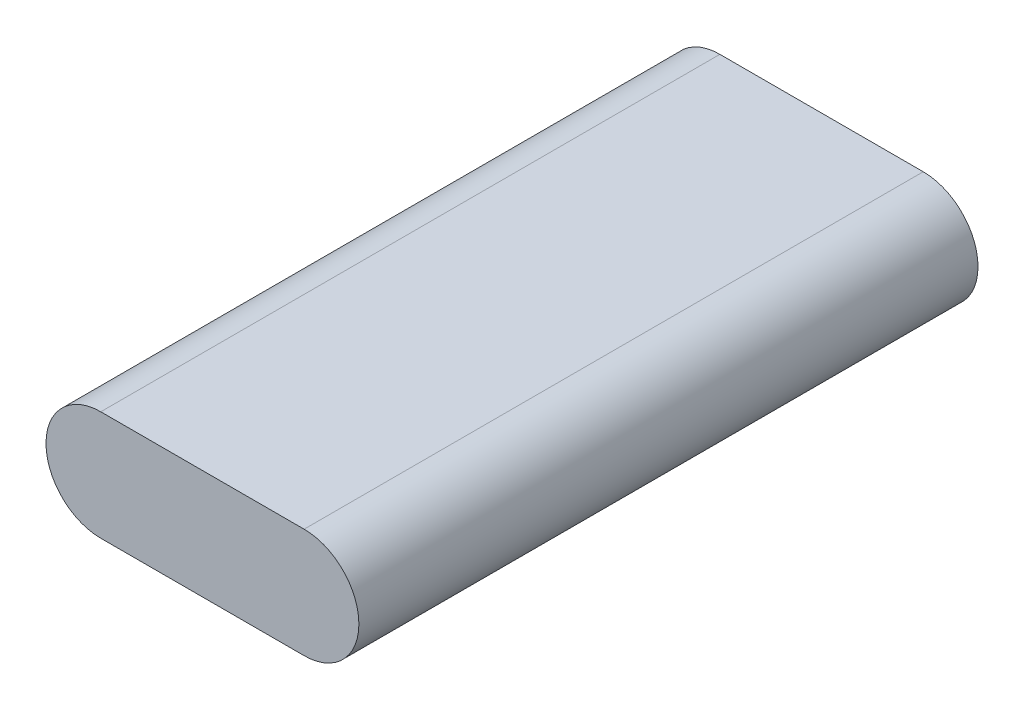
ISO-10303-21;
HEADER;
FILE_DESCRIPTION(('STEP AP214'),'2;1');
FILE_NAME('part.step','',(''),(''),'','','');
FILE_SCHEMA(('AUTOMOTIVE_DESIGN { 1 0 10303 214 1 1 1 1 }'));
ENDSEC;
DATA;
#1=APPLICATION_CONTEXT('core data for automotive mechanical design processes');
#2=APPLICATION_PROTOCOL_DEFINITION('international standard','automotive_design',2000,#1);
#3=PRODUCT_CONTEXT('',#1,'mechanical');
#4=PRODUCT('Part','Part','',(#3));
#5=PRODUCT_RELATED_PRODUCT_CATEGORY('part','',(#4));
#6=PRODUCT_DEFINITION_FORMATION('','',#4);
#7=PRODUCT_DEFINITION_CONTEXT('part definition',#1,'design');
#8=PRODUCT_DEFINITION('design','',#6,#7);
#9=PRODUCT_DEFINITION_SHAPE('','',#8);
#10=(LENGTH_UNIT() NAMED_UNIT(*) SI_UNIT(.MILLI.,.METRE.));
#11=(NAMED_UNIT(*) PLANE_ANGLE_UNIT() SI_UNIT($,.RADIAN.));
#12=(NAMED_UNIT(*) SI_UNIT($,.STERADIAN.) SOLID_ANGLE_UNIT());
#13=UNCERTAINTY_MEASURE_WITH_UNIT(LENGTH_MEASURE(1.E-05),#10,'distance_accuracy_value','');
#14=(GEOMETRIC_REPRESENTATION_CONTEXT(3) GLOBAL_UNCERTAINTY_ASSIGNED_CONTEXT((#13)) GLOBAL_UNIT_ASSIGNED_CONTEXT((#10,
#11,#12)) REPRESENTATION_CONTEXT('',''));
#15=CARTESIAN_POINT('',(0.,0.,0.));
#16=DIRECTION('',(0.,0.,1.));
#17=DIRECTION('',(1.,0.,0.));
#18=AXIS2_PLACEMENT_3D('',#15,#16,#17);
#19=CARTESIAN_POINT('',(0.,-10.0434533881483,130.));
#20=DIRECTION('',(0.,0.,-1.));
#21=DIRECTION('',(-1.,0.,0.));
#22=AXIS2_PLACEMENT_3D('',#19,#20,#21);
#23=CYLINDRICAL_SURFACE('',#22,11.5);
#24=CARTESIAN_POINT('',(0.,-10.0434533881483,0.));
#25=DIRECTION('',(0.,0.,1.));
#26=DIRECTION('',(1.,0.,0.));
#27=AXIS2_PLACEMENT_3D('',#24,#25,#26);
#28=CIRCLE('',#27,11.5);
#29=CARTESIAN_POINT('',(0.,1.45654661185173,0.));
#30=VERTEX_POINT('',#29);
#31=CARTESIAN_POINT('',(0.,-21.5434533881483,0.));
#32=VERTEX_POINT('',#31);
#33=EDGE_CURVE('E101',#30,#32,#28,.T.);
#34=ORIENTED_EDGE('',*,*,#33,.T.);
#35=DIRECTION('',(0.,0.,-1.));
#36=VECTOR('',#35,1.);
#37=CARTESIAN_POINT('',(0.,-21.5434533881483,130.));
#38=LINE('',#37,#36);
#39=CARTESIAN_POINT('',(0.,-21.5434533881483,130.));
#40=VERTEX_POINT('',#39);
#41=EDGE_CURVE('E11',#40,#32,#38,.T.);
#42=ORIENTED_EDGE('',*,*,#41,.F.);
#43=CARTESIAN_POINT('',(0.,-10.0434533881483,130.));
#44=DIRECTION('',(0.,0.,1.));
#45=DIRECTION('',(1.,0.,0.));
#46=AXIS2_PLACEMENT_3D('',#43,#44,#45);
#47=CIRCLE('',#46,11.5);
#48=CARTESIAN_POINT('',(0.,1.45654661185173,130.));
#49=VERTEX_POINT('',#48);
#50=EDGE_CURVE('E89',#49,#40,#47,.T.);
#51=ORIENTED_EDGE('',*,*,#50,.F.);
#52=DIRECTION('',(0.,0.,-1.));
#53=VECTOR('',#52,1.);
#54=CARTESIAN_POINT('',(0.,1.45654661185173,130.));
#55=LINE('',#54,#53);
#56=EDGE_CURVE('E97',#49,#30,#55,.T.);
#57=ORIENTED_EDGE('',*,*,#56,.T.);
#58=EDGE_LOOP('',(#34,#42,#51,#57));
#59=FACE_BOUND('',#58,.T.);
#60=ADVANCED_FACE('F38',(#59),#23,.T.);
#61=CARTESIAN_POINT('',(0.,-21.5434533881483,130.));
#62=DIRECTION('',(0.,1.,0.));
#63=DIRECTION('',(0.,0.,1.));
#64=AXIS2_PLACEMENT_3D('',#61,#62,#63);
#65=PLANE('',#64);
#66=DIRECTION('',(1.,0.,0.));
#67=VECTOR('',#66,1.);
#68=CARTESIAN_POINT('',(0.,-21.5434533881483,0.));
#69=LINE('',#68,#67);
#70=CARTESIAN_POINT('',(42.7,-21.5434533881483,0.));
#71=VERTEX_POINT('',#70);
#72=EDGE_CURVE('E93',#32,#71,#69,.T.);
#73=ORIENTED_EDGE('',*,*,#72,.T.);
#74=DIRECTION('',(0.,0.,-1.));
#75=VECTOR('',#74,1.);
#76=CARTESIAN_POINT('',(42.7,-21.5434533881483,130.));
#77=LINE('',#76,#75);
#78=CARTESIAN_POINT('',(42.7,-21.5434533881483,130.));
#79=VERTEX_POINT('',#78);
#80=EDGE_CURVE('E46',#79,#71,#77,.T.);
#81=ORIENTED_EDGE('',*,*,#80,.F.);
#82=DIRECTION('',(1.,0.,0.));
#83=VECTOR('',#82,1.);
#84=CARTESIAN_POINT('',(0.,-21.5434533881483,130.));
#85=LINE('',#84,#83);
#86=EDGE_CURVE('E84',#40,#79,#85,.T.);
#87=ORIENTED_EDGE('',*,*,#86,.F.);
#88=ORIENTED_EDGE('',*,*,#41,.T.);
#89=EDGE_LOOP('',(#73,#81,#87,#88));
#90=FACE_BOUND('',#89,.T.);
#91=ADVANCED_FACE('F92',(#90),#65,.F.);
#92=CARTESIAN_POINT('',(42.7,-10.0434533881483,130.));
#93=DIRECTION('',(0.,0.,-1.));
#94=DIRECTION('',(-1.,0.,0.));
#95=AXIS2_PLACEMENT_3D('',#92,#93,#94);
#96=CYLINDRICAL_SURFACE('',#95,11.5);
#97=CARTESIAN_POINT('',(42.7,-10.0434533881483,0.));
#98=DIRECTION('',(0.,0.,1.));
#99=DIRECTION('',(1.,0.,0.));
#100=AXIS2_PLACEMENT_3D('',#97,#98,#99);
#101=CIRCLE('',#100,11.5);
#102=CARTESIAN_POINT('',(42.7,1.45654661185173,0.));
#103=VERTEX_POINT('',#102);
#104=EDGE_CURVE('E71',#71,#103,#101,.T.);
#105=ORIENTED_EDGE('',*,*,#104,.T.);
#106=DIRECTION('',(0.,0.,-1.));
#107=VECTOR('',#106,1.);
#108=CARTESIAN_POINT('',(42.7,1.45654661185173,130.));
#109=LINE('',#108,#107);
#110=CARTESIAN_POINT('',(42.7,1.45654661185173,130.));
#111=VERTEX_POINT('',#110);
#112=EDGE_CURVE('E94',#111,#103,#109,.T.);
#113=ORIENTED_EDGE('',*,*,#112,.F.);
#114=CARTESIAN_POINT('',(42.7,-10.0434533881483,130.));
#115=DIRECTION('',(0.,0.,1.));
#116=DIRECTION('',(1.,0.,0.));
#117=AXIS2_PLACEMENT_3D('',#114,#115,#116);
#118=CIRCLE('',#117,11.5);
#119=EDGE_CURVE('E87',#79,#111,#118,.T.);
#120=ORIENTED_EDGE('',*,*,#119,.F.);
#121=ORIENTED_EDGE('',*,*,#80,.T.);
#122=EDGE_LOOP('',(#105,#113,#120,#121));
#123=FACE_BOUND('',#122,.T.);
#124=ADVANCED_FACE('F95',(#123),#96,.T.);
#125=CARTESIAN_POINT('',(0.,1.45654661185173,130.));
#126=DIRECTION('',(0.,-1.,0.));
#127=DIRECTION('',(0.,0.,-1.));
#128=AXIS2_PLACEMENT_3D('',#125,#126,#127);
#129=PLANE('',#128);
#130=DIRECTION('',(-1.,0.,0.));
#131=VECTOR('',#130,1.);
#132=CARTESIAN_POINT('',(0.,1.45654661185173,0.));
#133=LINE('',#132,#131);
#134=EDGE_CURVE('E77',#103,#30,#133,.T.);
#135=ORIENTED_EDGE('',*,*,#134,.T.);
#136=ORIENTED_EDGE('',*,*,#56,.F.);
#137=DIRECTION('',(-1.,0.,0.));
#138=VECTOR('',#137,1.);
#139=CARTESIAN_POINT('',(0.,1.45654661185173,130.));
#140=LINE('',#139,#138);
#141=EDGE_CURVE('E54',#111,#49,#140,.T.);
#142=ORIENTED_EDGE('',*,*,#141,.F.);
#143=ORIENTED_EDGE('',*,*,#112,.T.);
#144=EDGE_LOOP('',(#135,#136,#142,#143));
#145=FACE_BOUND('',#144,.T.);
#146=ADVANCED_FACE('F108',(#145),#129,.F.);
#147=CARTESIAN_POINT('',(0.,-10.0434533881483,130.));
#148=DIRECTION('',(0.,0.,1.));
#149=DIRECTION('',(1.,0.,0.));
#150=AXIS2_PLACEMENT_3D('',#147,#148,#149);
#151=PLANE('',#150);
#152=ORIENTED_EDGE('',*,*,#50,.T.);
#153=ORIENTED_EDGE('',*,*,#86,.T.);
#154=ORIENTED_EDGE('',*,*,#119,.T.);
#155=ORIENTED_EDGE('',*,*,#141,.T.);
#156=EDGE_LOOP('',(#152,#153,#154,#155));
#157=FACE_BOUND('',#156,.T.);
#158=ADVANCED_FACE('F85',(#157),#151,.T.);
#159=CARTESIAN_POINT('',(0.,-10.0434533881483,0.));
#160=DIRECTION('',(0.,0.,1.));
#161=DIRECTION('',(1.,0.,0.));
#162=AXIS2_PLACEMENT_3D('',#159,#160,#161);
#163=PLANE('',#162);
#164=ORIENTED_EDGE('',*,*,#33,.F.);
#165=ORIENTED_EDGE('',*,*,#134,.F.);
#166=ORIENTED_EDGE('',*,*,#104,.F.);
#167=ORIENTED_EDGE('',*,*,#72,.F.);
#168=EDGE_LOOP('',(#164,#165,#166,#167));
#169=FACE_BOUND('',#168,.T.);
#170=ADVANCED_FACE('F111',(#169),#163,.F.);
#171=CLOSED_SHELL('',(#60,#91,#124,#146,#158,#170));
#172=MANIFOLD_SOLID_BREP('B2',#171);
#173=ADVANCED_BREP_SHAPE_REPRESENTATION('',(#18,#172),#14);
#174=SHAPE_DEFINITION_REPRESENTATION(#9,#173);
ENDSEC;
END-ISO-10303-21;
